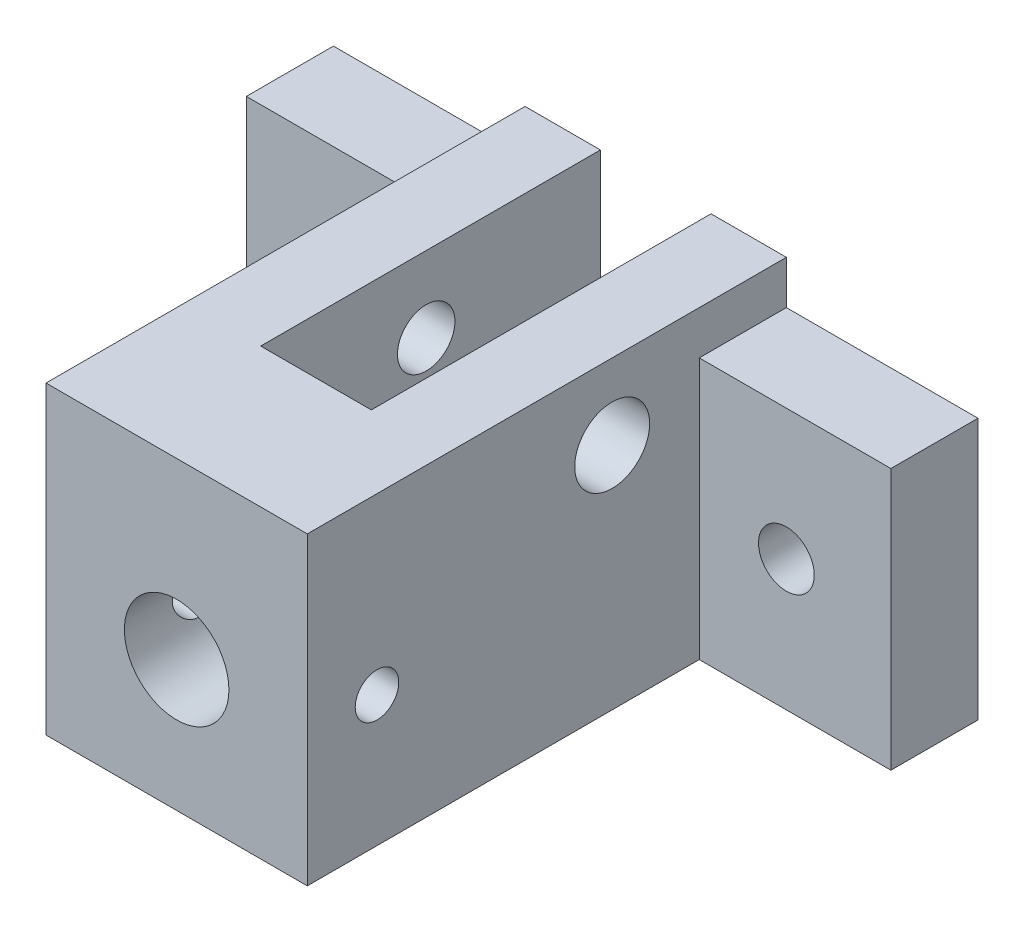
ISO-10303-21;
HEADER;
FILE_DESCRIPTION(('STEP AP214'),'2;1');
FILE_NAME('part.step','',(''),(''),'','','');
FILE_SCHEMA(('AUTOMOTIVE_DESIGN { 1 0 10303 214 1 1 1 1 }'));
ENDSEC;
DATA;
#1=APPLICATION_CONTEXT('core data for automotive mechanical design processes');
#2=APPLICATION_PROTOCOL_DEFINITION('international standard','automotive_design',2000,#1);
#3=PRODUCT_CONTEXT('',#1,'mechanical');
#4=PRODUCT('Part','Part','',(#3));
#5=PRODUCT_RELATED_PRODUCT_CATEGORY('part','',(#4));
#6=PRODUCT_DEFINITION_FORMATION('','',#4);
#7=PRODUCT_DEFINITION_CONTEXT('part definition',#1,'design');
#8=PRODUCT_DEFINITION('design','',#6,#7);
#9=PRODUCT_DEFINITION_SHAPE('','',#8);
#10=(LENGTH_UNIT() NAMED_UNIT(*) SI_UNIT(.MILLI.,.METRE.));
#11=(NAMED_UNIT(*) PLANE_ANGLE_UNIT() SI_UNIT($,.RADIAN.));
#12=(NAMED_UNIT(*) SI_UNIT($,.STERADIAN.) SOLID_ANGLE_UNIT());
#13=UNCERTAINTY_MEASURE_WITH_UNIT(LENGTH_MEASURE(1.E-05),#10,'distance_accuracy_value','');
#14=(GEOMETRIC_REPRESENTATION_CONTEXT(3) GLOBAL_UNCERTAINTY_ASSIGNED_CONTEXT((#13)) GLOBAL_UNIT_ASSIGNED_CONTEXT((#10,
#11,#12)) REPRESENTATION_CONTEXT('',''));
#15=CARTESIAN_POINT('',(0.,0.,0.));
#16=DIRECTION('',(0.,0.,1.));
#17=DIRECTION('',(1.,0.,0.));
#18=AXIS2_PLACEMENT_3D('',#15,#16,#17);
#19=CARTESIAN_POINT('',(-7.5,8.75,0.));
#20=DIRECTION('',(1.,0.,0.));
#21=DIRECTION('',(0.,0.,-1.));
#22=AXIS2_PLACEMENT_3D('',#19,#20,#21);
#23=PLANE('',#22);
#24=CARTESIAN_POINT('',(-7.5,-1.25,-4.));
#25=DIRECTION('',(-1.,0.,0.));
#26=DIRECTION('',(0.,0.,1.));
#27=AXIS2_PLACEMENT_3D('',#24,#25,#26);
#28=CIRCLE('',#27,1.24999999999999);
#29=CARTESIAN_POINT('',(-7.5,-1.25,-2.75000000000001));
#30=VERTEX_POINT('',#29);
#31=EDGE_CURVE('E216',#30,#30,#28,.T.);
#32=ORIENTED_EDGE('',*,*,#31,.F.);
#33=EDGE_LOOP('',(#32));
#34=FACE_BOUND('',#33,.T.);
#35=DIRECTION('',(0.,0.,1.));
#36=VECTOR('',#35,1.);
#37=CARTESIAN_POINT('',(-7.5,-8.75,0.));
#38=LINE('',#37,#36);
#39=CARTESIAN_POINT('',(-7.5,-8.75,-22.5));
#40=VERTEX_POINT('',#39);
#41=CARTESIAN_POINT('',(-7.5,-8.75,0.));
#42=VERTEX_POINT('',#41);
#43=EDGE_CURVE('E169',#40,#42,#38,.T.);
#44=ORIENTED_EDGE('',*,*,#43,.T.);
#45=DIRECTION('',(0.,-1.,0.));
#46=VECTOR('',#45,1.);
#47=CARTESIAN_POINT('',(-7.5,8.75,0.));
#48=LINE('',#47,#46);
#49=CARTESIAN_POINT('',(-7.5,8.75,0.));
#50=VERTEX_POINT('',#49);
#51=EDGE_CURVE('E140',#50,#42,#48,.T.);
#52=ORIENTED_EDGE('',*,*,#51,.F.);
#53=DIRECTION('',(0.,0.,1.));
#54=VECTOR('',#53,1.);
#55=CARTESIAN_POINT('',(-7.5,8.75,0.));
#56=LINE('',#55,#54);
#57=CARTESIAN_POINT('',(-7.5,8.75,-27.5));
#58=VERTEX_POINT('',#57);
#59=EDGE_CURVE('E128',#58,#50,#56,.T.);
#60=ORIENTED_EDGE('',*,*,#59,.F.);
#61=DIRECTION('',(0.,1.,0.));
#62=VECTOR('',#61,1.);
#63=CARTESIAN_POINT('',(-7.5,8.75,-27.5));
#64=LINE('',#63,#62);
#65=CARTESIAN_POINT('',(-7.5,6.25,-27.5));
#66=VERTEX_POINT('',#65);
#67=EDGE_CURVE('E293',#66,#58,#64,.T.);
#68=ORIENTED_EDGE('',*,*,#67,.F.);
#69=DIRECTION('',(0.,0.,1.));
#70=VECTOR('',#69,1.);
#71=CARTESIAN_POINT('',(-7.5,6.25,-27.5));
#72=LINE('',#71,#70);
#73=CARTESIAN_POINT('',(-7.5,6.25,-22.5));
#74=VERTEX_POINT('',#73);
#75=EDGE_CURVE('E304',#66,#74,#72,.T.);
#76=ORIENTED_EDGE('',*,*,#75,.T.);
#77=DIRECTION('',(0.,-1.,0.));
#78=VECTOR('',#77,1.);
#79=CARTESIAN_POINT('',(-7.5,8.75,-22.5));
#80=LINE('',#79,#78);
#81=EDGE_CURVE('E198',#74,#40,#80,.T.);
#82=ORIENTED_EDGE('',*,*,#81,.T.);
#83=EDGE_LOOP('',(#44,#52,#60,#68,#76,#82));
#84=FACE_BOUND('',#83,.T.);
#85=CARTESIAN_POINT('',(-7.5,4.41,-17.5));
#86=DIRECTION('',(1.,0.,0.));
#87=DIRECTION('',(0.,0.,-1.));
#88=AXIS2_PLACEMENT_3D('',#85,#86,#87);
#89=CIRCLE('',#88,1.65);
#90=CARTESIAN_POINT('',(-7.5,4.41,-19.15));
#91=VERTEX_POINT('',#90);
#92=EDGE_CURVE('E320',#91,#91,#89,.F.);
#93=ORIENTED_EDGE('',*,*,#92,.F.);
#94=EDGE_LOOP('',(#93));
#95=FACE_BOUND('',#94,.T.);
#96=ADVANCED_FACE('F39',(#34,#84,#95),#23,.F.);
#97=CARTESIAN_POINT('',(-3.175,8.75,-27.5));
#98=DIRECTION('',(-1.,0.,0.));
#99=DIRECTION('',(0.,0.,1.));
#100=AXIS2_PLACEMENT_3D('',#97,#98,#99);
#101=PLANE('',#100);
#102=CARTESIAN_POINT('',(-3.175,4.41,-17.5));
#103=DIRECTION('',(1.,0.,0.));
#104=DIRECTION('',(0.,0.,-1.));
#105=AXIS2_PLACEMENT_3D('',#102,#103,#104);
#106=CIRCLE('',#105,1.65);
#107=CARTESIAN_POINT('',(-3.175,4.41,-19.15));
#108=VERTEX_POINT('',#107);
#109=EDGE_CURVE('E319',#108,#108,#106,.T.);
#110=ORIENTED_EDGE('',*,*,#109,.F.);
#111=EDGE_LOOP('',(#110));
#112=FACE_BOUND('',#111,.T.);
#113=DIRECTION('',(0.,0.,-1.));
#114=VECTOR('',#113,1.);
#115=CARTESIAN_POINT('',(-3.175,-8.75,-27.5));
#116=LINE('',#115,#114);
#117=CARTESIAN_POINT('',(-3.175,-8.75,-8.));
#118=VERTEX_POINT('',#117);
#119=CARTESIAN_POINT('',(-3.175,-8.75,-27.5));
#120=VERTEX_POINT('',#119);
#121=EDGE_CURVE('E157',#118,#120,#116,.T.);
#122=ORIENTED_EDGE('',*,*,#121,.T.);
#123=DIRECTION('',(0.,-1.,0.));
#124=VECTOR('',#123,1.);
#125=CARTESIAN_POINT('',(-3.175,8.75,-27.5));
#126=LINE('',#125,#124);
#127=CARTESIAN_POINT('',(-3.175,8.75,-27.5));
#128=VERTEX_POINT('',#127);
#129=EDGE_CURVE('E204',#128,#120,#126,.T.);
#130=ORIENTED_EDGE('',*,*,#129,.F.);
#131=DIRECTION('',(0.,0.,-1.));
#132=VECTOR('',#131,1.);
#133=CARTESIAN_POINT('',(-3.175,8.75,-11.175));
#134=LINE('',#133,#132);
#135=CARTESIAN_POINT('',(-3.175,8.75,-8.));
#136=VERTEX_POINT('',#135);
#137=EDGE_CURVE('E115',#136,#128,#134,.T.);
#138=ORIENTED_EDGE('',*,*,#137,.F.);
#139=DIRECTION('',(0.,-1.,0.));
#140=VECTOR('',#139,1.);
#141=CARTESIAN_POINT('',(-3.175,8.75,-8.));
#142=LINE('',#141,#140);
#143=EDGE_CURVE('E47',#136,#118,#142,.T.);
#144=ORIENTED_EDGE('',*,*,#143,.T.);
#145=EDGE_LOOP('',(#122,#130,#138,#144));
#146=FACE_BOUND('',#145,.T.);
#147=ADVANCED_FACE('F41',(#112,#146),#101,.F.);
#148=CARTESIAN_POINT('',(-18.5,8.75,-27.5));
#149=DIRECTION('',(0.,0.,1.));
#150=DIRECTION('',(1.,0.,0.));
#151=AXIS2_PLACEMENT_3D('',#148,#149,#150);
#152=PLANE('',#151);
#153=CARTESIAN_POINT('',(-12.5,-1.25,-27.5));
#154=DIRECTION('',(0.,0.,1.));
#155=DIRECTION('',(1.,0.,0.));
#156=AXIS2_PLACEMENT_3D('',#153,#154,#155);
#157=CIRCLE('',#156,1.6);
#158=CARTESIAN_POINT('',(-10.9,-1.25,-27.5));
#159=VERTEX_POINT('',#158);
#160=EDGE_CURVE('E283',#159,#159,#157,.T.);
#161=ORIENTED_EDGE('',*,*,#160,.T.);
#162=EDGE_LOOP('',(#161));
#163=FACE_BOUND('',#162,.T.);
#164=DIRECTION('',(1.,0.,0.));
#165=VECTOR('',#164,1.);
#166=CARTESIAN_POINT('',(-18.5,6.25,-27.5));
#167=LINE('',#166,#165);
#168=CARTESIAN_POINT('',(-18.5,6.25,-27.5));
#169=VERTEX_POINT('',#168);
#170=EDGE_CURVE('E289',#169,#66,#167,.T.);
#171=ORIENTED_EDGE('',*,*,#170,.T.);
#172=ORIENTED_EDGE('',*,*,#67,.T.);
#173=DIRECTION('',(-1.,0.,0.));
#174=VECTOR('',#173,1.);
#175=CARTESIAN_POINT('',(-18.5,8.75,-27.5));
#176=LINE('',#175,#174);
#177=EDGE_CURVE('E353',#128,#58,#176,.T.);
#178=ORIENTED_EDGE('',*,*,#177,.F.);
#179=ORIENTED_EDGE('',*,*,#129,.T.);
#180=DIRECTION('',(-1.,0.,0.));
#181=VECTOR('',#180,1.);
#182=CARTESIAN_POINT('',(-18.5,-8.75,-27.5));
#183=LINE('',#182,#181);
#184=CARTESIAN_POINT('',(-18.5,-8.75,-27.5));
#185=VERTEX_POINT('',#184);
#186=EDGE_CURVE('E159',#120,#185,#183,.T.);
#187=ORIENTED_EDGE('',*,*,#186,.T.);
#188=DIRECTION('',(0.,-1.,0.));
#189=VECTOR('',#188,1.);
#190=CARTESIAN_POINT('',(-18.5,8.75,-27.5));
#191=LINE('',#190,#189);
#192=EDGE_CURVE('E202',#169,#185,#191,.T.);
#193=ORIENTED_EDGE('',*,*,#192,.F.);
#194=EDGE_LOOP('',(#171,#172,#178,#179,#187,#193));
#195=FACE_BOUND('',#194,.T.);
#196=ADVANCED_FACE('F263',(#163,#195),#152,.F.);
#197=CARTESIAN_POINT('',(-18.5,8.75,-22.5));
#198=DIRECTION('',(1.,0.,0.));
#199=DIRECTION('',(0.,0.,-1.));
#200=AXIS2_PLACEMENT_3D('',#197,#198,#199);
#201=PLANE('',#200);
#202=DIRECTION('',(0.,-1.,0.));
#203=VECTOR('',#202,1.);
#204=CARTESIAN_POINT('',(-18.5,8.75,-22.5));
#205=LINE('',#204,#203);
#206=CARTESIAN_POINT('',(-18.5,6.25,-22.5));
#207=VERTEX_POINT('',#206);
#208=CARTESIAN_POINT('',(-18.5,-8.75,-22.5));
#209=VERTEX_POINT('',#208);
#210=EDGE_CURVE('E200',#207,#209,#205,.T.);
#211=ORIENTED_EDGE('',*,*,#210,.F.);
#212=DIRECTION('',(0.,0.,1.));
#213=VECTOR('',#212,1.);
#214=CARTESIAN_POINT('',(-18.5,6.25,-27.5));
#215=LINE('',#214,#213);
#216=EDGE_CURVE('E299',#169,#207,#215,.T.);
#217=ORIENTED_EDGE('',*,*,#216,.F.);
#218=ORIENTED_EDGE('',*,*,#192,.T.);
#219=DIRECTION('',(0.,0.,1.));
#220=VECTOR('',#219,1.);
#221=CARTESIAN_POINT('',(-18.5,-8.75,-22.5));
#222=LINE('',#221,#220);
#223=EDGE_CURVE('E163',#185,#209,#222,.T.);
#224=ORIENTED_EDGE('',*,*,#223,.T.);
#225=EDGE_LOOP('',(#211,#217,#218,#224));
#226=FACE_BOUND('',#225,.T.);
#227=ADVANCED_FACE('F273',(#226),#201,.F.);
#228=CARTESIAN_POINT('',(-7.5,8.75,-22.5));
#229=DIRECTION('',(0.,0.,-1.));
#230=DIRECTION('',(-1.,0.,0.));
#231=AXIS2_PLACEMENT_3D('',#228,#229,#230);
#232=PLANE('',#231);
#233=CARTESIAN_POINT('',(-12.5,-1.25,-22.5));
#234=DIRECTION('',(0.,0.,1.));
#235=DIRECTION('',(1.,0.,0.));
#236=AXIS2_PLACEMENT_3D('',#233,#234,#235);
#237=CIRCLE('',#236,1.6);
#238=CARTESIAN_POINT('',(-10.9,-1.25,-22.5));
#239=VERTEX_POINT('',#238);
#240=EDGE_CURVE('E337',#239,#239,#237,.T.);
#241=ORIENTED_EDGE('',*,*,#240,.F.);
#242=EDGE_LOOP('',(#241));
#243=FACE_BOUND('',#242,.T.);
#244=ORIENTED_EDGE('',*,*,#81,.F.);
#245=DIRECTION('',(-1.,0.,0.));
#246=VECTOR('',#245,1.);
#247=CARTESIAN_POINT('',(-7.5,6.25,-22.5));
#248=LINE('',#247,#246);
#249=EDGE_CURVE('E11',#74,#207,#248,.T.);
#250=ORIENTED_EDGE('',*,*,#249,.T.);
#251=ORIENTED_EDGE('',*,*,#210,.T.);
#252=DIRECTION('',(1.,0.,0.));
#253=VECTOR('',#252,1.);
#254=CARTESIAN_POINT('',(-7.5,-8.75,-22.5));
#255=LINE('',#254,#253);
#256=EDGE_CURVE('E166',#209,#40,#255,.T.);
#257=ORIENTED_EDGE('',*,*,#256,.T.);
#258=EDGE_LOOP('',(#244,#250,#251,#257));
#259=FACE_BOUND('',#258,.T.);
#260=ADVANCED_FACE('F270',(#243,#259),#232,.F.);
#261=CARTESIAN_POINT('',(-7.5,8.75,0.));
#262=DIRECTION('',(0.,0.,-1.));
#263=DIRECTION('',(-1.,0.,0.));
#264=AXIS2_PLACEMENT_3D('',#261,#262,#263);
#265=PLANE('',#264);
#266=CARTESIAN_POINT('',(0.,-1.25,0.));
#267=DIRECTION('',(0.,0.,1.));
#268=DIRECTION('',(1.,0.,0.));
#269=AXIS2_PLACEMENT_3D('',#266,#267,#268);
#270=CIRCLE('',#269,3.);
#271=CARTESIAN_POINT('',(3.,-1.25,0.));
#272=VERTEX_POINT('',#271);
#273=EDGE_CURVE('E346',#272,#272,#270,.T.);
#274=ORIENTED_EDGE('',*,*,#273,.F.);
#275=EDGE_LOOP('',(#274));
#276=FACE_BOUND('',#275,.T.);
#277=DIRECTION('',(1.,0.,0.));
#278=VECTOR('',#277,1.);
#279=CARTESIAN_POINT('',(-7.5,-8.75,0.));
#280=LINE('',#279,#278);
#281=CARTESIAN_POINT('',(7.5,-8.75,0.));
#282=VERTEX_POINT('',#281);
#283=EDGE_CURVE('E136',#42,#282,#280,.T.);
#284=ORIENTED_EDGE('',*,*,#283,.T.);
#285=DIRECTION('',(0.,-1.,0.));
#286=VECTOR('',#285,1.);
#287=CARTESIAN_POINT('',(7.5,8.75,0.));
#288=LINE('',#287,#286);
#289=CARTESIAN_POINT('',(7.5,8.75,0.));
#290=VERTEX_POINT('',#289);
#291=EDGE_CURVE('E133',#290,#282,#288,.T.);
#292=ORIENTED_EDGE('',*,*,#291,.F.);
#293=DIRECTION('',(1.,0.,0.));
#294=VECTOR('',#293,1.);
#295=CARTESIAN_POINT('',(-7.5,8.75,0.));
#296=LINE('',#295,#294);
#297=EDGE_CURVE('E123',#50,#290,#296,.T.);
#298=ORIENTED_EDGE('',*,*,#297,.F.);
#299=ORIENTED_EDGE('',*,*,#51,.T.);
#300=EDGE_LOOP('',(#284,#292,#298,#299));
#301=FACE_BOUND('',#300,.T.);
#302=ADVANCED_FACE('F134',(#276,#301),#265,.F.);
#303=CARTESIAN_POINT('',(7.5,8.75,0.));
#304=DIRECTION('',(-1.,0.,0.));
#305=DIRECTION('',(0.,0.,1.));
#306=AXIS2_PLACEMENT_3D('',#303,#304,#305);
#307=PLANE('',#306);
#308=CARTESIAN_POINT('',(7.5,4.41,-17.5));
#309=DIRECTION('',(1.,0.,0.));
#310=DIRECTION('',(0.,0.,-1.));
#311=AXIS2_PLACEMENT_3D('',#308,#309,#310);
#312=CIRCLE('',#311,2.14999999999999);
#313=CARTESIAN_POINT('',(7.5,4.41,-19.65));
#314=VERTEX_POINT('',#313);
#315=EDGE_CURVE('E323',#314,#314,#312,.T.);
#316=ORIENTED_EDGE('',*,*,#315,.F.);
#317=EDGE_LOOP('',(#316));
#318=FACE_BOUND('',#317,.T.);
#319=DIRECTION('',(0.,-1.,0.));
#320=VECTOR('',#319,1.);
#321=CARTESIAN_POINT('',(7.5,8.75,-22.5));
#322=LINE('',#321,#320);
#323=CARTESIAN_POINT('',(7.50000000000001,6.25,-22.5));
#324=VERTEX_POINT('',#323);
#325=CARTESIAN_POINT('',(7.5,-8.75,-22.5));
#326=VERTEX_POINT('',#325);
#327=EDGE_CURVE('E141',#324,#326,#322,.T.);
#328=ORIENTED_EDGE('',*,*,#327,.F.);
#329=DIRECTION('',(0.,0.,1.));
#330=VECTOR('',#329,1.);
#331=CARTESIAN_POINT('',(7.50000000000001,6.25,-27.5));
#332=LINE('',#331,#330);
#333=CARTESIAN_POINT('',(7.50000000000001,6.25,-27.5));
#334=VERTEX_POINT('',#333);
#335=EDGE_CURVE('E309',#334,#324,#332,.T.);
#336=ORIENTED_EDGE('',*,*,#335,.F.);
#337=DIRECTION('',(0.,-1.,0.));
#338=VECTOR('',#337,1.);
#339=CARTESIAN_POINT('',(7.50000000000001,6.25,-27.5));
#340=LINE('',#339,#338);
#341=CARTESIAN_POINT('',(7.50000000000001,8.75,-27.5));
#342=VERTEX_POINT('',#341);
#343=EDGE_CURVE('E148',#342,#334,#340,.T.);
#344=ORIENTED_EDGE('',*,*,#343,.F.);
#345=DIRECTION('',(0.,0.,-1.));
#346=VECTOR('',#345,1.);
#347=CARTESIAN_POINT('',(7.5,8.75,0.));
#348=LINE('',#347,#346);
#349=EDGE_CURVE('E54',#290,#342,#348,.T.);
#350=ORIENTED_EDGE('',*,*,#349,.F.);
#351=ORIENTED_EDGE('',*,*,#291,.T.);
#352=DIRECTION('',(0.,0.,-1.));
#353=VECTOR('',#352,1.);
#354=CARTESIAN_POINT('',(7.5,-8.75,0.));
#355=LINE('',#354,#353);
#356=EDGE_CURVE('E173',#282,#326,#355,.T.);
#357=ORIENTED_EDGE('',*,*,#356,.T.);
#358=EDGE_LOOP('',(#328,#336,#344,#350,#351,#357));
#359=FACE_BOUND('',#358,.T.);
#360=CARTESIAN_POINT('',(7.5,-1.25,-4.));
#361=DIRECTION('',(-1.,0.,0.));
#362=DIRECTION('',(0.,0.,1.));
#363=AXIS2_PLACEMENT_3D('',#360,#361,#362);
#364=CIRCLE('',#363,1.24999999999999);
#365=CARTESIAN_POINT('',(7.5,-1.25,-2.75000000000001));
#366=VERTEX_POINT('',#365);
#367=EDGE_CURVE('E343',#366,#366,#364,.T.);
#368=ORIENTED_EDGE('',*,*,#367,.T.);
#369=EDGE_LOOP('',(#368));
#370=FACE_BOUND('',#369,.T.);
#371=ADVANCED_FACE('F144',(#318,#359,#370),#307,.F.);
#372=CARTESIAN_POINT('',(7.5,8.75,-22.5));
#373=DIRECTION('',(0.,0.,-1.));
#374=DIRECTION('',(-1.,0.,0.));
#375=AXIS2_PLACEMENT_3D('',#372,#373,#374);
#376=PLANE('',#375);
#377=CARTESIAN_POINT('',(12.5,-1.25,-22.5));
#378=DIRECTION('',(0.,0.,1.));
#379=DIRECTION('',(1.,0.,0.));
#380=AXIS2_PLACEMENT_3D('',#377,#378,#379);
#381=CIRCLE('',#380,1.6);
#382=CARTESIAN_POINT('',(14.1,-1.25,-22.5));
#383=VERTEX_POINT('',#382);
#384=EDGE_CURVE('E329',#383,#383,#381,.T.);
#385=ORIENTED_EDGE('',*,*,#384,.F.);
#386=EDGE_LOOP('',(#385));
#387=FACE_BOUND('',#386,.T.);
#388=DIRECTION('',(0.,-1.,0.));
#389=VECTOR('',#388,1.);
#390=CARTESIAN_POINT('',(18.5,8.75,-22.5));
#391=LINE('',#390,#389);
#392=CARTESIAN_POINT('',(18.5,6.25,-22.5));
#393=VERTEX_POINT('',#392);
#394=CARTESIAN_POINT('',(18.5,-8.75,-22.5));
#395=VERTEX_POINT('',#394);
#396=EDGE_CURVE('E194',#393,#395,#391,.T.);
#397=ORIENTED_EDGE('',*,*,#396,.F.);
#398=DIRECTION('',(-1.,0.,0.));
#399=VECTOR('',#398,1.);
#400=CARTESIAN_POINT('',(7.5,6.25,-22.5));
#401=LINE('',#400,#399);
#402=EDGE_CURVE('E307',#393,#324,#401,.T.);
#403=ORIENTED_EDGE('',*,*,#402,.T.);
#404=ORIENTED_EDGE('',*,*,#327,.T.);
#405=DIRECTION('',(1.,0.,0.));
#406=VECTOR('',#405,1.);
#407=CARTESIAN_POINT('',(7.5,-8.75,-22.5));
#408=LINE('',#407,#406);
#409=EDGE_CURVE('E175',#326,#395,#408,.T.);
#410=ORIENTED_EDGE('',*,*,#409,.T.);
#411=EDGE_LOOP('',(#397,#403,#404,#410));
#412=FACE_BOUND('',#411,.T.);
#413=ADVANCED_FACE('F378',(#387,#412),#376,.F.);
#414=CARTESIAN_POINT('',(18.5,8.75,-22.5));
#415=DIRECTION('',(-1.,0.,0.));
#416=DIRECTION('',(0.,0.,1.));
#417=AXIS2_PLACEMENT_3D('',#414,#415,#416);
#418=PLANE('',#417);
#419=DIRECTION('',(0.,-1.,0.));
#420=VECTOR('',#419,1.);
#421=CARTESIAN_POINT('',(18.5,8.75,-27.5));
#422=LINE('',#421,#420);
#423=CARTESIAN_POINT('',(18.5,6.25,-27.5));
#424=VERTEX_POINT('',#423);
#425=CARTESIAN_POINT('',(18.5,-8.75,-27.5));
#426=VERTEX_POINT('',#425);
#427=EDGE_CURVE('E192',#424,#426,#422,.T.);
#428=ORIENTED_EDGE('',*,*,#427,.F.);
#429=DIRECTION('',(0.,0.,1.));
#430=VECTOR('',#429,1.);
#431=CARTESIAN_POINT('',(18.5,6.25,-27.5));
#432=LINE('',#431,#430);
#433=EDGE_CURVE('E312',#424,#393,#432,.T.);
#434=ORIENTED_EDGE('',*,*,#433,.T.);
#435=ORIENTED_EDGE('',*,*,#396,.T.);
#436=DIRECTION('',(0.,0.,-1.));
#437=VECTOR('',#436,1.);
#438=CARTESIAN_POINT('',(18.5,-8.75,-22.5));
#439=LINE('',#438,#437);
#440=EDGE_CURVE('E178',#395,#426,#439,.T.);
#441=ORIENTED_EDGE('',*,*,#440,.T.);
#442=EDGE_LOOP('',(#428,#434,#435,#441));
#443=FACE_BOUND('',#442,.T.);
#444=ADVANCED_FACE('F385',(#443),#418,.F.);
#445=CARTESIAN_POINT('',(18.5,8.75,-27.5));
#446=DIRECTION('',(0.,0.,1.));
#447=DIRECTION('',(1.,0.,0.));
#448=AXIS2_PLACEMENT_3D('',#445,#446,#447);
#449=PLANE('',#448);
#450=CARTESIAN_POINT('',(12.5,-1.25,-27.5));
#451=DIRECTION('',(0.,0.,1.));
#452=DIRECTION('',(1.,0.,0.));
#453=AXIS2_PLACEMENT_3D('',#450,#451,#452);
#454=CIRCLE('',#453,1.6);
#455=CARTESIAN_POINT('',(14.1,-1.25,-27.5));
#456=VERTEX_POINT('',#455);
#457=EDGE_CURVE('E334',#456,#456,#454,.T.);
#458=ORIENTED_EDGE('',*,*,#457,.T.);
#459=EDGE_LOOP('',(#458));
#460=FACE_BOUND('',#459,.T.);
#461=DIRECTION('',(-1.,0.,0.));
#462=VECTOR('',#461,1.);
#463=CARTESIAN_POINT('',(18.5,8.75,-27.5));
#464=LINE('',#463,#462);
#465=CARTESIAN_POINT('',(3.175,8.75,-27.5));
#466=VERTEX_POINT('',#465);
#467=EDGE_CURVE('E150',#342,#466,#464,.T.);
#468=ORIENTED_EDGE('',*,*,#467,.F.);
#469=ORIENTED_EDGE('',*,*,#343,.T.);
#470=DIRECTION('',(1.,0.,0.));
#471=VECTOR('',#470,1.);
#472=CARTESIAN_POINT('',(7.50000000000001,6.25,-27.5));
#473=LINE('',#472,#471);
#474=EDGE_CURVE('E301',#334,#424,#473,.T.);
#475=ORIENTED_EDGE('',*,*,#474,.T.);
#476=ORIENTED_EDGE('',*,*,#427,.T.);
#477=DIRECTION('',(-1.,0.,0.));
#478=VECTOR('',#477,1.);
#479=CARTESIAN_POINT('',(18.5,-8.75,-27.5));
#480=LINE('',#479,#478);
#481=CARTESIAN_POINT('',(3.175,-8.75,-27.5));
#482=VERTEX_POINT('',#481);
#483=EDGE_CURVE('E181',#426,#482,#480,.T.);
#484=ORIENTED_EDGE('',*,*,#483,.T.);
#485=DIRECTION('',(0.,-1.,0.));
#486=VECTOR('',#485,1.);
#487=CARTESIAN_POINT('',(3.175,8.75,-27.5));
#488=LINE('',#487,#486);
#489=EDGE_CURVE('E190',#466,#482,#488,.T.);
#490=ORIENTED_EDGE('',*,*,#489,.F.);
#491=EDGE_LOOP('',(#468,#469,#475,#476,#484,#490));
#492=FACE_BOUND('',#491,.T.);
#493=ADVANCED_FACE('F389',(#460,#492),#449,.F.);
#494=CARTESIAN_POINT('',(3.175,8.75,-11.175));
#495=DIRECTION('',(1.,0.,0.));
#496=DIRECTION('',(0.,0.,-1.));
#497=AXIS2_PLACEMENT_3D('',#494,#495,#496);
#498=PLANE('',#497);
#499=CARTESIAN_POINT('',(3.17500000000001,4.41,-17.5));
#500=DIRECTION('',(1.,0.,0.));
#501=DIRECTION('',(0.,0.,-1.));
#502=AXIS2_PLACEMENT_3D('',#499,#500,#501);
#503=CIRCLE('',#502,2.14999999999999);
#504=CARTESIAN_POINT('',(3.17500000000001,4.41,-19.65));
#505=VERTEX_POINT('',#504);
#506=EDGE_CURVE('E326',#505,#505,#503,.F.);
#507=ORIENTED_EDGE('',*,*,#506,.F.);
#508=EDGE_LOOP('',(#507));
#509=FACE_BOUND('',#508,.T.);
#510=DIRECTION('',(0.,0.,1.));
#511=VECTOR('',#510,1.);
#512=CARTESIAN_POINT('',(3.175,-8.75,-11.175));
#513=LINE('',#512,#511);
#514=CARTESIAN_POINT('',(3.175,-8.75,-8.));
#515=VERTEX_POINT('',#514);
#516=EDGE_CURVE('E106',#482,#515,#513,.T.);
#517=ORIENTED_EDGE('',*,*,#516,.T.);
#518=DIRECTION('',(0.,-1.,0.));
#519=VECTOR('',#518,1.);
#520=CARTESIAN_POINT('',(3.175,8.75,-8.));
#521=LINE('',#520,#519);
#522=CARTESIAN_POINT('',(3.175,8.75,-8.));
#523=VERTEX_POINT('',#522);
#524=EDGE_CURVE('E156',#523,#515,#521,.T.);
#525=ORIENTED_EDGE('',*,*,#524,.F.);
#526=DIRECTION('',(0.,0.,1.));
#527=VECTOR('',#526,1.);
#528=CARTESIAN_POINT('',(3.175,8.75,-27.5));
#529=LINE('',#528,#527);
#530=EDGE_CURVE('E61',#466,#523,#529,.T.);
#531=ORIENTED_EDGE('',*,*,#530,.F.);
#532=ORIENTED_EDGE('',*,*,#489,.T.);
#533=EDGE_LOOP('',(#517,#525,#531,#532));
#534=FACE_BOUND('',#533,.T.);
#535=ADVANCED_FACE('F392',(#509,#534),#498,.F.);
#536=CARTESIAN_POINT('',(3.175,8.75,-8.));
#537=DIRECTION('',(0.,0.,1.));
#538=DIRECTION('',(1.,0.,0.));
#539=AXIS2_PLACEMENT_3D('',#536,#537,#538);
#540=PLANE('',#539);
#541=CARTESIAN_POINT('',(0.,-1.25,-8.));
#542=DIRECTION('',(0.,0.,1.));
#543=DIRECTION('',(1.,0.,0.));
#544=AXIS2_PLACEMENT_3D('',#541,#542,#543);
#545=CIRCLE('',#544,3.);
#546=CARTESIAN_POINT('',(3.,-1.25,-8.));
#547=VERTEX_POINT('',#546);
#548=EDGE_CURVE('E160',#547,#547,#545,.T.);
#549=ORIENTED_EDGE('',*,*,#548,.T.);
#550=EDGE_LOOP('',(#549));
#551=FACE_BOUND('',#550,.T.);
#552=DIRECTION('',(-1.,0.,0.));
#553=VECTOR('',#552,1.);
#554=CARTESIAN_POINT('',(3.175,-8.75,-8.));
#555=LINE('',#554,#553);
#556=EDGE_CURVE('E185',#515,#118,#555,.T.);
#557=ORIENTED_EDGE('',*,*,#556,.T.);
#558=ORIENTED_EDGE('',*,*,#143,.F.);
#559=DIRECTION('',(-1.,0.,0.));
#560=VECTOR('',#559,1.);
#561=CARTESIAN_POINT('',(0.,8.75,-8.));
#562=LINE('',#561,#560);
#563=EDGE_CURVE('E188',#523,#136,#562,.T.);
#564=ORIENTED_EDGE('',*,*,#563,.F.);
#565=ORIENTED_EDGE('',*,*,#524,.T.);
#566=EDGE_LOOP('',(#557,#558,#564,#565));
#567=FACE_BOUND('',#566,.T.);
#568=ADVANCED_FACE('F394',(#551,#567),#540,.F.);
#569=CARTESIAN_POINT('',(0.,8.75,0.));
#570=DIRECTION('',(0.,1.,0.));
#571=DIRECTION('',(0.,0.,1.));
#572=AXIS2_PLACEMENT_3D('',#569,#570,#571);
#573=PLANE('',#572);
#574=ORIENTED_EDGE('',*,*,#177,.T.);
#575=ORIENTED_EDGE('',*,*,#59,.T.);
#576=ORIENTED_EDGE('',*,*,#297,.T.);
#577=ORIENTED_EDGE('',*,*,#349,.T.);
#578=ORIENTED_EDGE('',*,*,#467,.T.);
#579=ORIENTED_EDGE('',*,*,#530,.T.);
#580=ORIENTED_EDGE('',*,*,#563,.T.);
#581=ORIENTED_EDGE('',*,*,#137,.T.);
#582=EDGE_LOOP('',(#574,#575,#576,#577,#578,#579,#580,#581));
#583=FACE_BOUND('',#582,.T.);
#584=ADVANCED_FACE('F126',(#583),#573,.T.);
#585=CARTESIAN_POINT('',(0.,-8.75,0.));
#586=DIRECTION('',(0.,1.,0.));
#587=DIRECTION('',(0.,0.,1.));
#588=AXIS2_PLACEMENT_3D('',#585,#586,#587);
#589=PLANE('',#588);
#590=ORIENTED_EDGE('',*,*,#121,.F.);
#591=ORIENTED_EDGE('',*,*,#556,.F.);
#592=ORIENTED_EDGE('',*,*,#516,.F.);
#593=ORIENTED_EDGE('',*,*,#483,.F.);
#594=ORIENTED_EDGE('',*,*,#440,.F.);
#595=ORIENTED_EDGE('',*,*,#409,.F.);
#596=ORIENTED_EDGE('',*,*,#356,.F.);
#597=ORIENTED_EDGE('',*,*,#283,.F.);
#598=ORIENTED_EDGE('',*,*,#43,.F.);
#599=ORIENTED_EDGE('',*,*,#256,.F.);
#600=ORIENTED_EDGE('',*,*,#223,.F.);
#601=ORIENTED_EDGE('',*,*,#186,.F.);
#602=EDGE_LOOP('',(#590,#591,#592,#593,#594,#595,#596,#597,#598,#599,#600,#601));
#603=FACE_BOUND('',#602,.T.);
#604=ADVANCED_FACE('F359',(#603),#589,.F.);
#605=CARTESIAN_POINT('',(0.,-1.25,0.));
#606=DIRECTION('',(0.,0.,1.));
#607=DIRECTION('',(1.,0.,0.));
#608=AXIS2_PLACEMENT_3D('',#605,#606,#607);
#609=CYLINDRICAL_SURFACE('',#608,3.);
#610=CARTESIAN_POINT('',(3.,-1.25,-5.24999999999999));
#611=CARTESIAN_POINT('',(2.99999458367272,-1.18304194736373,-5.2499927949087));
#612=CARTESIAN_POINT('',(2.9977323297471,-1.11597860293616,-5.24458804147186));
#613=CARTESIAN_POINT('',(2.98890153579551,-0.983752628843656,-5.22316093507982));
#614=CARTESIAN_POINT('',(2.98232175901027,-0.918595423576439,-5.20711087553575));
#615=CARTESIAN_POINT('',(2.96556289038127,-0.792311266346916,-5.16508890821941));
#616=CARTESIAN_POINT('',(2.95539599975003,-0.731171475573736,-5.13915061053185));
#617=CARTESIAN_POINT('',(2.93245286470664,-0.614170243320203,-5.07822717676743));
#618=CARTESIAN_POINT('',(2.91967741092849,-0.558307209984066,-5.04324478102913));
#619=CARTESIAN_POINT('',(2.89207828351868,-0.450551596440495,-4.96337101740912));
#620=CARTESIAN_POINT('',(2.87718753326092,-0.398958732482238,-4.91809869121024));
#621=CARTESIAN_POINT('',(2.84732714068513,-0.303840178908745,-4.81973566521743));
#622=CARTESIAN_POINT('',(2.83235746106809,-0.260318736846923,-4.76664087510549));
#623=CARTESIAN_POINT('',(2.80321021812995,-0.180462623029354,-4.6509732224351));
#624=CARTESIAN_POINT('',(2.78910786873385,-0.144586918460759,-4.58806255157346));
#625=CARTESIAN_POINT('',(2.76435572357005,-0.0840605941113526,-4.45642674207907));
#626=CARTESIAN_POINT('',(2.75370415000823,-0.059404191637102,-4.38770462051555));
#627=CARTESIAN_POINT('',(2.73778555387705,-0.0232540168784217,-4.24984630823208));
#628=CARTESIAN_POINT('',(2.73228387651787,-0.0111834212239541,-4.18088951660785));
#629=CARTESIAN_POINT('',(2.72661326219504,0.00125209967795357,-4.04172670731343));
#630=CARTESIAN_POINT('',(2.7264413842526,0.00162348054396286,-3.97152139997426));
#631=CARTESIAN_POINT('',(2.73125119560852,-0.00891549636327168,-3.83759993956507));
#632=CARTESIAN_POINT('',(2.73583882723623,-0.0189631888770021,-3.77379890343554));
#633=CARTESIAN_POINT('',(2.74898482773796,-0.0486080898422439,-3.64888790899962));
#634=CARTESIAN_POINT('',(2.75754395703563,-0.0682071271282414,-3.58777846850823));
#635=CARTESIAN_POINT('',(2.77786184772756,-0.116780412724299,-3.46844229700856));
#636=CARTESIAN_POINT('',(2.78968481949136,-0.145945284607649,-3.41030457908663));
#637=CARTESIAN_POINT('',(2.81518331141086,-0.212687574194385,-3.29952226611986));
#638=CARTESIAN_POINT('',(2.82885956129779,-0.250268309480464,-3.24687984938649));
#639=CARTESIAN_POINT('',(2.85792976877979,-0.336504034456173,-3.14390004126717));
#640=CARTESIAN_POINT('',(2.87337121404472,-0.385826516792481,-3.09413343261457));
#641=CARTESIAN_POINT('',(2.90325673112529,-0.492270408948495,-3.00338649704083));
#642=CARTESIAN_POINT('',(2.91770056877009,-0.54939364055155,-2.96240822830783));
#643=CARTESIAN_POINT('',(2.94438283556473,-0.671552051306629,-2.88956417638374));
#644=CARTESIAN_POINT('',(2.95656266543333,-0.736739417552325,-2.85793055484933));
#645=CARTESIAN_POINT('',(2.97689481414803,-0.872147597473173,-2.80627886039675));
#646=CARTESIAN_POINT('',(2.985049358458,-0.942365605204969,-2.7862543680562));
#647=CARTESIAN_POINT('',(2.99599641186384,-1.08107188665378,-2.75958400787338));
#648=CARTESIAN_POINT('',(2.99909541047125,-1.14938871472136,-2.75217214255626));
#649=CARTESIAN_POINT('',(3.00056050368744,-1.28635465549609,-2.74865377638592));
#650=CARTESIAN_POINT('',(2.99892795711938,-1.35500366715264,-2.75254402974801));
#651=CARTESIAN_POINT('',(2.99131217656939,-1.48709824234143,-2.77097108480608));
#652=CARTESIAN_POINT('',(2.98554887283989,-1.55063296663939,-2.78496995409721));
#653=CARTESIAN_POINT('',(2.97048606772414,-1.67438274897109,-2.8224681945408));
#654=CARTESIAN_POINT('',(2.96118611959703,-1.73459738651836,-2.84596876595031));
#655=CARTESIAN_POINT('',(2.93958270645165,-1.85210899986913,-2.90257097571213));
#656=CARTESIAN_POINT('',(2.92719491469281,-1.90925723685532,-2.93594818314604));
#657=CARTESIAN_POINT('',(2.9007380457909,-2.01734621623143,-3.01105337779171));
#658=CARTESIAN_POINT('',(2.88666826768733,-2.06828435260194,-3.05278485152929));
#659=CARTESIAN_POINT('',(2.85712087895437,-2.16633343027426,-3.14690323327242));
#660=CARTESIAN_POINT('',(2.84161451591029,-2.21291069797983,-3.19983850298627));
#661=CARTESIAN_POINT('',(2.81184336768005,-2.2966698461055,-3.3130212759354));
#662=CARTESIAN_POINT('',(2.79757886493438,-2.33384959285617,-3.37327043517174));
#663=CARTESIAN_POINT('',(2.77181386243988,-2.39815960208699,-3.50061417530259));
#664=CARTESIAN_POINT('',(2.76035562555111,-2.42513918237328,-3.56779403551484));
#665=CARTESIAN_POINT('',(2.74208355658957,-2.46717413951572,-3.70637059381011));
#666=CARTESIAN_POINT('',(2.73526589555752,-2.48223934863687,-3.77776376248335));
#667=CARTESIAN_POINT('',(2.72763164537264,-2.499040803489,-3.91681869919922));
#668=CARTESIAN_POINT('',(2.72639350967162,-2.50171380413128,-3.98434466229262));
#669=CARTESIAN_POINT('',(2.72893853011024,-2.49615575523911,-4.11884286114111));
#670=CARTESIAN_POINT('',(2.73272091540306,-2.48792637964721,-4.1858151803137));
#671=CARTESIAN_POINT('',(2.74449551302268,-2.4615840478049,-4.31409274746889));
#672=CARTESIAN_POINT('',(2.7522835484648,-2.44394903571465,-4.37551667346339));
#673=CARTESIAN_POINT('',(2.77103181199189,-2.39976328202134,-4.49454802135723));
#674=CARTESIAN_POINT('',(2.78199293131693,-2.37321003517251,-4.55215436539878));
#675=CARTESIAN_POINT('',(2.80666954560013,-2.31010285935489,-4.66569589594912));
#676=CARTESIAN_POINT('',(2.82051102713679,-2.27304360910482,-4.72132233016829));
#677=CARTESIAN_POINT('',(2.84903689053839,-2.19068407263038,-4.82586013936068));
#678=CARTESIAN_POINT('',(2.86372156345874,-2.14538092890561,-4.87476917560057));
#679=CARTESIAN_POINT('',(2.89356392850106,-2.04390204577881,-4.96814868168474));
#680=CARTESIAN_POINT('',(2.90867817511791,-1.98717473994902,-5.01203643284065));
#681=CARTESIAN_POINT('',(2.9366014362202,-1.86660007925319,-5.08969945354362));
#682=CARTESIAN_POINT('',(2.9494093991674,-1.80274949794574,-5.12347011488955));
#683=CARTESIAN_POINT('',(2.9710918336246,-1.67073205671795,-5.17920984543988));
#684=CARTESIAN_POINT('',(2.98002782581963,-1.60265399098063,-5.20136476661729));
#685=CARTESIAN_POINT('',(2.99321009768624,-1.46341042184656,-5.23370632907783));
#686=CARTESIAN_POINT('',(2.99747105811966,-1.39225531698095,-5.24393044252988));
#687=CARTESIAN_POINT('',(2.99972287568933,-1.29723608191918,-5.24933316108644));
#688=CARTESIAN_POINT('',(3.00000191102535,-1.27362459467566,-5.25000254214922));
#689=CARTESIAN_POINT('',(3.,-1.25,-5.24999999999999));
#690=B_SPLINE_CURVE_WITH_KNOTS('',3,(#610,#611,#612,#613,#614,#615,#616,#617,#618,#619,#620,
#621,#622,#623,#624,#625,#626,#627,#628,#629,#630,#631,#632,#633,#634,#635,#636,#637,#638,#639,
#640,#641,#642,#643,#644,#645,#646,#647,#648,#649,#650,#651,#652,#653,#654,#655,#656,#657,#658,
#659,#660,#661,#662,#663,#664,#665,#666,#667,#668,#669,#670,#671,#672,#673,#674,#675,#676,#677,
#678,#679,#680,#681,#682,#683,#684,#685,#686,#687,#688,#689),.UNSPECIFIED.,.T.,.F.,(4,2,2,2,2,2,
2,2,2,2,2,2,2,2,2,2,2,2,2,2,2,2,2,2,2,2,2,2,2,2,2,2,2,2,2,2,2,2,2,4),(0.,0.200806918883938,
0.402138540628694,0.602791851906297,0.803384436852969,1.01317936288806,1.22308438131465,
1.44331724539124,1.66343646730587,1.87295273137556,2.08235338249045,2.27570157202555,
2.46908679727211,2.66658713058713,2.86416545717204,3.07844141127894,3.29276749314586,
3.51204055060811,3.73119224218294,3.93648443393248,4.14171767493169,4.33676589735718,
4.53183876601782,4.73297135272158,4.93418805469492,5.14978488029291,5.36543061240338,
5.5841478835952,5.80268447074576,6.00439877559639,6.20608211297532,6.39837649964758,
6.59072494950608,6.79463893397436,6.99862373425939,7.21746535004884,7.43640649428577,
7.6517285581938,7.86637250469316,7.93722256499092),.UNSPECIFIED.);
#691=CARTESIAN_POINT('',(3.,-1.25,-5.24999999999999));
#692=VERTEX_POINT('',#691);
#693=EDGE_CURVE('E215',#692,#692,#690,.T.);
#694=ORIENTED_EDGE('',*,*,#693,.T.);
#695=EDGE_LOOP('',(#694));
#696=FACE_BOUND('',#695,.T.);
#697=CARTESIAN_POINT('',(-3.,-1.25,-2.75000000000001));
#698=CARTESIAN_POINT('',(-2.99999458367272,-1.18304194736373,-2.75000720509131));
#699=CARTESIAN_POINT('',(-2.9977323297471,-1.11597860293616,-2.75541195852815));
#700=CARTESIAN_POINT('',(-2.98890153579551,-0.983752628843656,-2.77683906492019));
#701=CARTESIAN_POINT('',(-2.98232175901027,-0.918595423576439,-2.79288912446426));
#702=CARTESIAN_POINT('',(-2.96556289038127,-0.792311266346916,-2.8349110917806));
#703=CARTESIAN_POINT('',(-2.95539599975003,-0.731171475573736,-2.86084938946816));
#704=CARTESIAN_POINT('',(-2.93245286470664,-0.614170243320203,-2.92177282323258));
#705=CARTESIAN_POINT('',(-2.91967741092849,-0.558307209984066,-2.95675521897088));
#706=CARTESIAN_POINT('',(-2.89207828351868,-0.450551596440495,-3.03662898259089));
#707=CARTESIAN_POINT('',(-2.87718753326093,-0.398958732482238,-3.08190130878976));
#708=CARTESIAN_POINT('',(-2.84732714068513,-0.303840178908746,-3.18026433478258));
#709=CARTESIAN_POINT('',(-2.83235746106809,-0.260318736846923,-3.23335912489451));
#710=CARTESIAN_POINT('',(-2.80321021812995,-0.180462623029354,-3.3490267775649));
#711=CARTESIAN_POINT('',(-2.78910786873384,-0.144586918460759,-3.41193744842655));
#712=CARTESIAN_POINT('',(-2.76435572357005,-0.0840605941113527,-3.54357325792094));
#713=CARTESIAN_POINT('',(-2.75370415000823,-0.0594041916371021,-3.61229537948446));
#714=CARTESIAN_POINT('',(-2.73778555387705,-0.0232540168784218,-3.75015369176793));
#715=CARTESIAN_POINT('',(-2.73228387651787,-0.0111834212239541,-3.81911048339216));
#716=CARTESIAN_POINT('',(-2.72661326219504,0.00125209967795364,-3.95827329268657));
#717=CARTESIAN_POINT('',(-2.7264413842526,0.00162348054396282,-4.02847860002574));
#718=CARTESIAN_POINT('',(-2.73125119560852,-0.0089154963632716,-4.16240006043494));
#719=CARTESIAN_POINT('',(-2.73583882723623,-0.0189631888770018,-4.22620109656446));
#720=CARTESIAN_POINT('',(-2.74898482773796,-0.0486080898422435,-4.35111209100039));
#721=CARTESIAN_POINT('',(-2.75754395703563,-0.0682071271282411,-4.41222153149177));
#722=CARTESIAN_POINT('',(-2.77786184772756,-0.116780412724299,-4.53155770299144));
#723=CARTESIAN_POINT('',(-2.78968481949136,-0.145945284607649,-4.58969542091338));
#724=CARTESIAN_POINT('',(-2.81518331141086,-0.212687574194385,-4.70047773388014));
#725=CARTESIAN_POINT('',(-2.82885956129779,-0.250268309480465,-4.75312015061352));
#726=CARTESIAN_POINT('',(-2.85792976877979,-0.336504034456173,-4.85609995873284));
#727=CARTESIAN_POINT('',(-2.87337121404472,-0.385826516792481,-4.90586656738543));
#728=CARTESIAN_POINT('',(-2.90325673112529,-0.492270408948495,-4.99661350295918));
#729=CARTESIAN_POINT('',(-2.91770056877009,-0.54939364055155,-5.03759177169217));
#730=CARTESIAN_POINT('',(-2.94438283556473,-0.671552051306629,-5.11043582361626));
#731=CARTESIAN_POINT('',(-2.95656266543333,-0.736739417552324,-5.14206944515068));
#732=CARTESIAN_POINT('',(-2.97689481414803,-0.872147597473172,-5.19372113960325));
#733=CARTESIAN_POINT('',(-2.985049358458,-0.942365605204968,-5.21374563194381));
#734=CARTESIAN_POINT('',(-2.99599641186384,-1.08107188665377,-5.24041599212663));
#735=CARTESIAN_POINT('',(-2.99909541047125,-1.14938871472136,-5.24782785744374));
#736=CARTESIAN_POINT('',(-3.00056050368744,-1.28635465549609,-5.25134622361409));
#737=CARTESIAN_POINT('',(-2.99892795711938,-1.35500366715264,-5.24745597025199));
#738=CARTESIAN_POINT('',(-2.9913121765694,-1.48709824234143,-5.22902891519393));
#739=CARTESIAN_POINT('',(-2.98554887283989,-1.55063296663939,-5.2150300459028));
#740=CARTESIAN_POINT('',(-2.97048606772414,-1.67438274897109,-5.17753180545921));
#741=CARTESIAN_POINT('',(-2.96118611959703,-1.73459738651836,-5.15403123404969));
#742=CARTESIAN_POINT('',(-2.93958270645165,-1.85210899986913,-5.09742902428788));
#743=CARTESIAN_POINT('',(-2.92719491469281,-1.90925723685532,-5.06405181685396));
#744=CARTESIAN_POINT('',(-2.9007380457909,-2.01734621623143,-4.9889466222083));
#745=CARTESIAN_POINT('',(-2.88666826768733,-2.06828435260194,-4.94721514847072));
#746=CARTESIAN_POINT('',(-2.85712087895437,-2.16633343027426,-4.85309676672759));
#747=CARTESIAN_POINT('',(-2.84161451591029,-2.21291069797983,-4.80016149701373));
#748=CARTESIAN_POINT('',(-2.81184336768005,-2.2966698461055,-4.6869787240646));
#749=CARTESIAN_POINT('',(-2.79757886493438,-2.33384959285617,-4.62672956482826));
#750=CARTESIAN_POINT('',(-2.77181386243988,-2.39815960208699,-4.49938582469742));
#751=CARTESIAN_POINT('',(-2.76035562555111,-2.42513918237328,-4.43220596448517));
#752=CARTESIAN_POINT('',(-2.74208355658957,-2.46717413951572,-4.29362940618989));
#753=CARTESIAN_POINT('',(-2.73526589555752,-2.48223934863687,-4.22223623751665));
#754=CARTESIAN_POINT('',(-2.72763164537264,-2.499040803489,-4.08318130080079));
#755=CARTESIAN_POINT('',(-2.72639350967162,-2.50171380413128,-4.01565533770739));
#756=CARTESIAN_POINT('',(-2.72893853011024,-2.49615575523911,-3.8811571388589));
#757=CARTESIAN_POINT('',(-2.73272091540306,-2.48792637964721,-3.81418481968631));
#758=CARTESIAN_POINT('',(-2.74449551302268,-2.4615840478049,-3.68590725253111));
#759=CARTESIAN_POINT('',(-2.7522835484648,-2.44394903571465,-3.62448332653661));
#760=CARTESIAN_POINT('',(-2.77103181199189,-2.39976328202134,-3.50545197864278));
#761=CARTESIAN_POINT('',(-2.78199293131693,-2.37321003517251,-3.44784563460122));
#762=CARTESIAN_POINT('',(-2.80666954560013,-2.31010285935489,-3.33430410405088));
#763=CARTESIAN_POINT('',(-2.82051102713679,-2.27304360910482,-3.27867766983172));
#764=CARTESIAN_POINT('',(-2.84903689053839,-2.19068407263038,-3.17413986063933));
#765=CARTESIAN_POINT('',(-2.86372156345874,-2.14538092890561,-3.12523082439944));
#766=CARTESIAN_POINT('',(-2.89356392850106,-2.04390204577881,-3.03185131831526));
#767=CARTESIAN_POINT('',(-2.90867817511791,-1.98717473994902,-2.98796356715936));
#768=CARTESIAN_POINT('',(-2.9366014362202,-1.86660007925319,-2.91030054645638));
#769=CARTESIAN_POINT('',(-2.9494093991674,-1.80274949794574,-2.87652988511045));
#770=CARTESIAN_POINT('',(-2.9710918336246,-1.67073205671795,-2.82079015456013));
#771=CARTESIAN_POINT('',(-2.98002782581963,-1.60265399098063,-2.79863523338271));
#772=CARTESIAN_POINT('',(-2.99321009768624,-1.46341042184656,-2.76629367092218));
#773=CARTESIAN_POINT('',(-2.99747105811966,-1.39225531698095,-2.75606955747013));
#774=CARTESIAN_POINT('',(-2.99972287568933,-1.29723608191918,-2.75066683891356));
#775=CARTESIAN_POINT('',(-3.00000191102535,-1.27362459467566,-2.74999745785079));
#776=CARTESIAN_POINT('',(-3.,-1.25,-2.75000000000001));
#777=B_SPLINE_CURVE_WITH_KNOTS('',3,(#697,#698,#699,#700,#701,#702,#703,#704,#705,#706,#707,
#708,#709,#710,#711,#712,#713,#714,#715,#716,#717,#718,#719,#720,#721,#722,#723,#724,#725,#726,
#727,#728,#729,#730,#731,#732,#733,#734,#735,#736,#737,#738,#739,#740,#741,#742,#743,#744,#745,
#746,#747,#748,#749,#750,#751,#752,#753,#754,#755,#756,#757,#758,#759,#760,#761,#762,#763,#764,
#765,#766,#767,#768,#769,#770,#771,#772,#773,#774,#775,#776),.UNSPECIFIED.,.T.,.F.,(4,2,2,2,2,2,
2,2,2,2,2,2,2,2,2,2,2,2,2,2,2,2,2,2,2,2,2,2,2,2,2,2,2,2,2,2,2,2,2,4),(0.,0.200806918883937,
0.402138540628694,0.602791851906297,0.803384436852969,1.01317936288806,1.22308438131465,
1.44331724539124,1.66343646730587,1.87295273137556,2.08235338249045,2.27570157202555,
2.46908679727211,2.66658713058713,2.86416545717204,3.07844141127894,3.29276749314586,
3.51204055060811,3.73119224218294,3.93648443393248,4.14171767493169,4.33676589735718,
4.53183876601782,4.73297135272158,4.93418805469492,5.1497848802929,5.36543061240337,
5.58414788359519,5.80268447074576,6.00439877559639,6.20608211297532,6.39837649964758,
6.59072494950608,6.79463893397436,6.99862373425939,7.21746535004884,7.43640649428577,
7.6517285581938,7.86637250469316,7.93722256499092),.UNSPECIFIED.);
#778=CARTESIAN_POINT('',(-3.,-1.25,-2.75000000000001));
#779=VERTEX_POINT('',#778);
#780=EDGE_CURVE('E208',#779,#779,#777,.T.);
#781=ORIENTED_EDGE('',*,*,#780,.T.);
#782=EDGE_LOOP('',(#781));
#783=FACE_BOUND('',#782,.T.);
#784=ORIENTED_EDGE('',*,*,#273,.T.);
#785=EDGE_LOOP('',(#784));
#786=FACE_BOUND('',#785,.T.);
#787=ORIENTED_EDGE('',*,*,#548,.F.);
#788=EDGE_LOOP('',(#787));
#789=FACE_BOUND('',#788,.T.);
#790=ADVANCED_FACE('F220',(#696,#783,#786,#789),#609,.F.);
#791=CARTESIAN_POINT('',(-7.5,-1.25,-4.));
#792=DIRECTION('',(-1.,0.,0.));
#793=DIRECTION('',(0.,0.,1.));
#794=AXIS2_PLACEMENT_3D('',#791,#792,#793);
#795=CYLINDRICAL_SURFACE('',#794,1.24999999999999);
#796=ORIENTED_EDGE('',*,*,#31,.T.);
#797=EDGE_LOOP('',(#796));
#798=FACE_BOUND('',#797,.T.);
#799=ORIENTED_EDGE('',*,*,#780,.F.);
#800=EDGE_LOOP('',(#799));
#801=FACE_BOUND('',#800,.T.);
#802=ADVANCED_FACE('F228',(#798,#801),#795,.F.);
#803=ORIENTED_EDGE('',*,*,#693,.F.);
#804=EDGE_LOOP('',(#803));
#805=FACE_BOUND('',#804,.T.);
#806=ORIENTED_EDGE('',*,*,#367,.F.);
#807=EDGE_LOOP('',(#806));
#808=FACE_BOUND('',#807,.T.);
#809=ADVANCED_FACE('F223',(#805,#808),#795,.F.);
#810=CARTESIAN_POINT('',(-12.5,-1.25,-22.5));
#811=DIRECTION('',(0.,0.,1.));
#812=DIRECTION('',(1.,0.,0.));
#813=AXIS2_PLACEMENT_3D('',#810,#811,#812);
#814=CYLINDRICAL_SURFACE('',#813,1.6);
#815=ORIENTED_EDGE('',*,*,#160,.F.);
#816=EDGE_LOOP('',(#815));
#817=FACE_BOUND('',#816,.T.);
#818=ORIENTED_EDGE('',*,*,#240,.T.);
#819=EDGE_LOOP('',(#818));
#820=FACE_BOUND('',#819,.T.);
#821=ADVANCED_FACE('F227',(#817,#820),#814,.F.);
#822=CARTESIAN_POINT('',(12.5,-1.25,-22.5));
#823=DIRECTION('',(0.,0.,1.));
#824=DIRECTION('',(1.,0.,0.));
#825=AXIS2_PLACEMENT_3D('',#822,#823,#824);
#826=CYLINDRICAL_SURFACE('',#825,1.6);
#827=ORIENTED_EDGE('',*,*,#457,.F.);
#828=EDGE_LOOP('',(#827));
#829=FACE_BOUND('',#828,.T.);
#830=ORIENTED_EDGE('',*,*,#384,.T.);
#831=EDGE_LOOP('',(#830));
#832=FACE_BOUND('',#831,.T.);
#833=ADVANCED_FACE('F233',(#829,#832),#826,.F.);
#834=CARTESIAN_POINT('',(7.5,4.41,-17.5));
#835=DIRECTION('',(1.,0.,0.));
#836=DIRECTION('',(0.,0.,-1.));
#837=AXIS2_PLACEMENT_3D('',#834,#835,#836);
#838=CYLINDRICAL_SURFACE('',#837,2.14999999999999);
#839=ORIENTED_EDGE('',*,*,#506,.T.);
#840=EDGE_LOOP('',(#839));
#841=FACE_BOUND('',#840,.T.);
#842=ORIENTED_EDGE('',*,*,#315,.T.);
#843=EDGE_LOOP('',(#842));
#844=FACE_BOUND('',#843,.T.);
#845=ADVANCED_FACE('F237',(#841,#844),#838,.F.);
#846=CARTESIAN_POINT('',(-3.175,4.41,-17.5));
#847=DIRECTION('',(1.,0.,0.));
#848=DIRECTION('',(0.,0.,-1.));
#849=AXIS2_PLACEMENT_3D('',#846,#847,#848);
#850=CYLINDRICAL_SURFACE('',#849,1.65);
#851=ORIENTED_EDGE('',*,*,#92,.T.);
#852=EDGE_LOOP('',(#851));
#853=FACE_BOUND('',#852,.T.);
#854=ORIENTED_EDGE('',*,*,#109,.T.);
#855=EDGE_LOOP('',(#854));
#856=FACE_BOUND('',#855,.T.);
#857=ADVANCED_FACE('F241',(#853,#856),#850,.F.);
#858=CARTESIAN_POINT('',(7.50000000000001,6.25,-27.5));
#859=DIRECTION('',(0.,-1.,0.));
#860=DIRECTION('',(0.,0.,-1.));
#861=AXIS2_PLACEMENT_3D('',#858,#859,#860);
#862=PLANE('',#861);
#863=ORIENTED_EDGE('',*,*,#433,.F.);
#864=ORIENTED_EDGE('',*,*,#474,.F.);
#865=ORIENTED_EDGE('',*,*,#335,.T.);
#866=ORIENTED_EDGE('',*,*,#402,.F.);
#867=EDGE_LOOP('',(#863,#864,#865,#866));
#868=FACE_BOUND('',#867,.T.);
#869=ADVANCED_FACE('F245',(#868),#862,.F.);
#870=CARTESIAN_POINT('',(-18.5,6.25,-27.5));
#871=DIRECTION('',(0.,-1.,0.));
#872=DIRECTION('',(0.,0.,-1.));
#873=AXIS2_PLACEMENT_3D('',#870,#871,#872);
#874=PLANE('',#873);
#875=ORIENTED_EDGE('',*,*,#75,.F.);
#876=ORIENTED_EDGE('',*,*,#170,.F.);
#877=ORIENTED_EDGE('',*,*,#216,.T.);
#878=ORIENTED_EDGE('',*,*,#249,.F.);
#879=EDGE_LOOP('',(#875,#876,#877,#878));
#880=FACE_BOUND('',#879,.T.);
#881=ADVANCED_FACE('F249',(#880),#874,.F.);
#882=CLOSED_SHELL('',(#96,#147,#196,#227,#260,#302,#371,#413,#444,#493,#535,#568,#584,#604,#790,
#802,#809,#821,#833,#845,#857,#869,#881));
#883=MANIFOLD_SOLID_BREP('B2',#882);
#884=ADVANCED_BREP_SHAPE_REPRESENTATION('',(#18,#883),#14);
#885=SHAPE_DEFINITION_REPRESENTATION(#9,#884);
ENDSEC;
END-ISO-10303-21;
